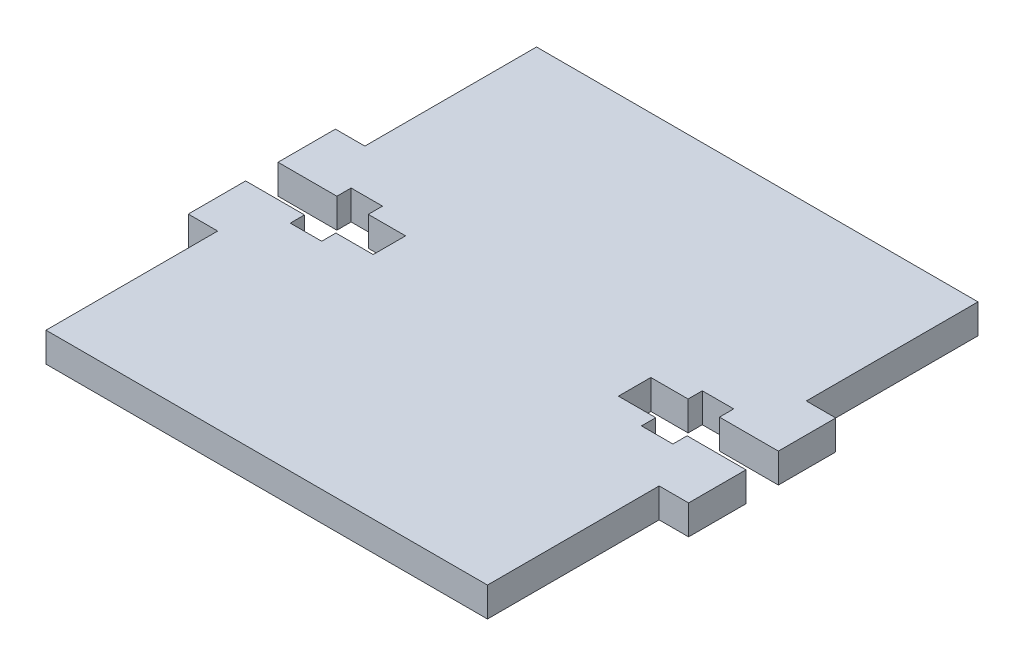
ISO-10303-21;
HEADER;
FILE_DESCRIPTION(('STEP AP214'),'2;1');
FILE_NAME('part.step','',(''),(''),'','','');
FILE_SCHEMA(('AUTOMOTIVE_DESIGN { 1 0 10303 214 1 1 1 1 }'));
ENDSEC;
DATA;
#1=APPLICATION_CONTEXT('core data for automotive mechanical design processes');
#2=APPLICATION_PROTOCOL_DEFINITION('international standard','automotive_design',2000,#1);
#3=PRODUCT_CONTEXT('',#1,'mechanical');
#4=PRODUCT('Part','Part','',(#3));
#5=PRODUCT_RELATED_PRODUCT_CATEGORY('part','',(#4));
#6=PRODUCT_DEFINITION_FORMATION('','',#4);
#7=PRODUCT_DEFINITION_CONTEXT('part definition',#1,'design');
#8=PRODUCT_DEFINITION('design','',#6,#7);
#9=PRODUCT_DEFINITION_SHAPE('','',#8);
#10=(LENGTH_UNIT() NAMED_UNIT(*) SI_UNIT(.MILLI.,.METRE.));
#11=(NAMED_UNIT(*) PLANE_ANGLE_UNIT() SI_UNIT($,.RADIAN.));
#12=(NAMED_UNIT(*) SI_UNIT($,.STERADIAN.) SOLID_ANGLE_UNIT());
#13=UNCERTAINTY_MEASURE_WITH_UNIT(LENGTH_MEASURE(1.E-05),#10,'distance_accuracy_value','');
#14=(GEOMETRIC_REPRESENTATION_CONTEXT(3) GLOBAL_UNCERTAINTY_ASSIGNED_CONTEXT((#13)) GLOBAL_UNIT_ASSIGNED_CONTEXT((#10,
#11,#12)) REPRESENTATION_CONTEXT('',''));
#15=CARTESIAN_POINT('',(0.,0.,0.));
#16=DIRECTION('',(0.,0.,1.));
#17=DIRECTION('',(1.,0.,0.));
#18=AXIS2_PLACEMENT_3D('',#15,#16,#17);
#19=CARTESIAN_POINT('',(0.,1.5,0.));
#20=DIRECTION('',(0.,1.,0.));
#21=DIRECTION('',(0.,0.,1.));
#22=AXIS2_PLACEMENT_3D('',#19,#20,#21);
#23=PLANE('',#22);
#24=DIRECTION('',(0.,0.,1.));
#25=VECTOR('',#24,1.);
#26=CARTESIAN_POINT('',(-19.5,1.5,0.));
#27=LINE('',#26,#25);
#28=CARTESIAN_POINT('',(-19.5,1.5,1.65));
#29=VERTEX_POINT('',#28);
#30=CARTESIAN_POINT('',(-19.5,1.5,3.1));
#31=VERTEX_POINT('',#30);
#32=EDGE_CURVE('E366',#29,#31,#27,.T.);
#33=ORIENTED_EDGE('',*,*,#32,.F.);
#34=DIRECTION('',(-1.,0.,0.));
#35=VECTOR('',#34,1.);
#36=CARTESIAN_POINT('',(0.,1.5,1.65));
#37=LINE('',#36,#35);
#38=CARTESIAN_POINT('',(-25.5,1.5,1.65));
#39=VERTEX_POINT('',#38);
#40=EDGE_CURVE('E352',#29,#39,#37,.T.);
#41=ORIENTED_EDGE('',*,*,#40,.T.);
#42=DIRECTION('',(0.,0.,1.));
#43=VECTOR('',#42,1.);
#44=CARTESIAN_POINT('',(-25.5,1.5,0.));
#45=LINE('',#44,#43);
#46=CARTESIAN_POINT('',(-25.5,1.5,7.5));
#47=VERTEX_POINT('',#46);
#48=EDGE_CURVE('E476',#39,#47,#45,.T.);
#49=ORIENTED_EDGE('',*,*,#48,.T.);
#50=DIRECTION('',(-1.,0.,0.));
#51=VECTOR('',#50,1.);
#52=CARTESIAN_POINT('',(0.,1.5,7.5));
#53=LINE('',#52,#51);
#54=CARTESIAN_POINT('',(-22.5,1.5,7.5));
#55=VERTEX_POINT('',#54);
#56=EDGE_CURVE('E480',#55,#47,#53,.T.);
#57=ORIENTED_EDGE('',*,*,#56,.F.);
#58=DIRECTION('',(0.,0.,1.));
#59=VECTOR('',#58,1.);
#60=CARTESIAN_POINT('',(-22.5,1.5,0.));
#61=LINE('',#60,#59);
#62=CARTESIAN_POINT('',(-22.5,1.5,25.));
#63=VERTEX_POINT('',#62);
#64=EDGE_CURVE('E474',#55,#63,#61,.T.);
#65=ORIENTED_EDGE('',*,*,#64,.T.);
#66=DIRECTION('',(1.,0.,0.));
#67=VECTOR('',#66,1.);
#68=CARTESIAN_POINT('',(0.,1.5,25.));
#69=LINE('',#68,#67);
#70=CARTESIAN_POINT('',(22.5,1.5,25.));
#71=VERTEX_POINT('',#70);
#72=EDGE_CURVE('E483',#63,#71,#69,.T.);
#73=ORIENTED_EDGE('',*,*,#72,.T.);
#74=DIRECTION('',(0.,0.,1.));
#75=VECTOR('',#74,1.);
#76=CARTESIAN_POINT('',(22.5,1.5,0.));
#77=LINE('',#76,#75);
#78=CARTESIAN_POINT('',(22.5,1.5,7.5));
#79=VERTEX_POINT('',#78);
#80=EDGE_CURVE('E468',#79,#71,#77,.T.);
#81=ORIENTED_EDGE('',*,*,#80,.F.);
#82=DIRECTION('',(1.,0.,0.));
#83=VECTOR('',#82,1.);
#84=CARTESIAN_POINT('',(0.,1.5,7.5));
#85=LINE('',#84,#83);
#86=CARTESIAN_POINT('',(25.5,1.5,7.5));
#87=VERTEX_POINT('',#86);
#88=EDGE_CURVE('E485',#79,#87,#85,.T.);
#89=ORIENTED_EDGE('',*,*,#88,.T.);
#90=DIRECTION('',(0.,0.,1.));
#91=VECTOR('',#90,1.);
#92=CARTESIAN_POINT('',(25.5,1.5,0.));
#93=LINE('',#92,#91);
#94=CARTESIAN_POINT('',(25.5,1.5,1.65));
#95=VERTEX_POINT('',#94);
#96=EDGE_CURVE('E488',#95,#87,#93,.T.);
#97=ORIENTED_EDGE('',*,*,#96,.F.);
#98=DIRECTION('',(1.,0.,0.));
#99=VECTOR('',#98,1.);
#100=CARTESIAN_POINT('',(0.,1.5,1.65));
#101=LINE('',#100,#99);
#102=CARTESIAN_POINT('',(19.5,1.5,1.65));
#103=VERTEX_POINT('',#102);
#104=EDGE_CURVE('E442',#103,#95,#101,.T.);
#105=ORIENTED_EDGE('',*,*,#104,.F.);
#106=DIRECTION('',(0.,0.,1.));
#107=VECTOR('',#106,1.);
#108=CARTESIAN_POINT('',(19.5,1.5,0.));
#109=LINE('',#108,#107);
#110=CARTESIAN_POINT('',(19.5,1.5,3.1));
#111=VERTEX_POINT('',#110);
#112=EDGE_CURVE('E439',#103,#111,#109,.T.);
#113=ORIENTED_EDGE('',*,*,#112,.T.);
#114=DIRECTION('',(1.,0.,0.));
#115=VECTOR('',#114,1.);
#116=CARTESIAN_POINT('',(0.,1.5,3.1));
#117=LINE('',#116,#115);
#118=CARTESIAN_POINT('',(16.3,1.5,3.1));
#119=VERTEX_POINT('',#118);
#120=EDGE_CURVE('E437',#119,#111,#117,.T.);
#121=ORIENTED_EDGE('',*,*,#120,.F.);
#122=DIRECTION('',(0.,0.,1.));
#123=VECTOR('',#122,1.);
#124=CARTESIAN_POINT('',(16.3,1.5,0.));
#125=LINE('',#124,#123);
#126=CARTESIAN_POINT('',(16.3,1.5,1.65));
#127=VERTEX_POINT('',#126);
#128=EDGE_CURVE('E405',#127,#119,#125,.T.);
#129=ORIENTED_EDGE('',*,*,#128,.F.);
#130=DIRECTION('',(1.,0.,0.));
#131=VECTOR('',#130,1.);
#132=CARTESIAN_POINT('',(0.,1.5,1.65));
#133=LINE('',#132,#131);
#134=CARTESIAN_POINT('',(12.5,1.5,1.65));
#135=VERTEX_POINT('',#134);
#136=EDGE_CURVE('E460',#135,#127,#133,.T.);
#137=ORIENTED_EDGE('',*,*,#136,.F.);
#138=DIRECTION('',(0.,0.,1.));
#139=VECTOR('',#138,1.);
#140=CARTESIAN_POINT('',(12.5,1.5,0.));
#141=LINE('',#140,#139);
#142=CARTESIAN_POINT('',(12.5,1.5,-1.65));
#143=VERTEX_POINT('',#142);
#144=EDGE_CURVE('E458',#143,#135,#141,.T.);
#145=ORIENTED_EDGE('',*,*,#144,.F.);
#146=DIRECTION('',(1.,0.,0.));
#147=VECTOR('',#146,1.);
#148=CARTESIAN_POINT('',(0.,1.5,-1.65));
#149=LINE('',#148,#147);
#150=CARTESIAN_POINT('',(16.3,1.5,-1.65));
#151=VERTEX_POINT('',#150);
#152=EDGE_CURVE('E455',#143,#151,#149,.T.);
#153=ORIENTED_EDGE('',*,*,#152,.T.);
#154=DIRECTION('',(0.,0.,1.));
#155=VECTOR('',#154,1.);
#156=CARTESIAN_POINT('',(16.3,1.5,0.));
#157=LINE('',#156,#155);
#158=CARTESIAN_POINT('',(16.3,1.5,-3.1));
#159=VERTEX_POINT('',#158);
#160=EDGE_CURVE('E453',#159,#151,#157,.T.);
#161=ORIENTED_EDGE('',*,*,#160,.F.);
#162=DIRECTION('',(1.,0.,0.));
#163=VECTOR('',#162,1.);
#164=CARTESIAN_POINT('',(0.,1.5,-3.1));
#165=LINE('',#164,#163);
#166=CARTESIAN_POINT('',(19.5,1.5,-3.1));
#167=VERTEX_POINT('',#166);
#168=EDGE_CURVE('E450',#159,#167,#165,.T.);
#169=ORIENTED_EDGE('',*,*,#168,.T.);
#170=DIRECTION('',(0.,0.,1.));
#171=VECTOR('',#170,1.);
#172=CARTESIAN_POINT('',(19.5,1.5,0.));
#173=LINE('',#172,#171);
#174=CARTESIAN_POINT('',(19.5,1.5,-1.65));
#175=VERTEX_POINT('',#174);
#176=EDGE_CURVE('E447',#167,#175,#173,.T.);
#177=ORIENTED_EDGE('',*,*,#176,.T.);
#178=DIRECTION('',(1.,0.,0.));
#179=VECTOR('',#178,1.);
#180=CARTESIAN_POINT('',(0.,1.5,-1.65));
#181=LINE('',#180,#179);
#182=CARTESIAN_POINT('',(25.5,1.5,-1.65));
#183=VERTEX_POINT('',#182);
#184=EDGE_CURVE('E444',#175,#183,#181,.T.);
#185=ORIENTED_EDGE('',*,*,#184,.T.);
#186=CARTESIAN_POINT('',(25.5,1.5,-7.5));
#187=VERTEX_POINT('',#186);
#188=EDGE_CURVE('E489',#187,#183,#93,.T.);
#189=ORIENTED_EDGE('',*,*,#188,.F.);
#190=DIRECTION('',(1.,0.,0.));
#191=VECTOR('',#190,1.);
#192=CARTESIAN_POINT('',(0.,1.5,-7.49999999999999));
#193=LINE('',#192,#191);
#194=CARTESIAN_POINT('',(22.5,1.5,-7.5));
#195=VERTEX_POINT('',#194);
#196=EDGE_CURVE('E492',#195,#187,#193,.T.);
#197=ORIENTED_EDGE('',*,*,#196,.F.);
#198=CARTESIAN_POINT('',(22.5,1.5,-25.));
#199=VERTEX_POINT('',#198);
#200=EDGE_CURVE('E463',#199,#195,#77,.T.);
#201=ORIENTED_EDGE('',*,*,#200,.F.);
#202=DIRECTION('',(1.,0.,0.));
#203=VECTOR('',#202,1.);
#204=CARTESIAN_POINT('',(0.,1.5,-25.));
#205=LINE('',#204,#203);
#206=CARTESIAN_POINT('',(-22.5,1.5,-25.));
#207=VERTEX_POINT('',#206);
#208=EDGE_CURVE('E466',#207,#199,#205,.T.);
#209=ORIENTED_EDGE('',*,*,#208,.F.);
#210=CARTESIAN_POINT('',(-22.5,1.5,-7.5));
#211=VERTEX_POINT('',#210);
#212=EDGE_CURVE('E471',#207,#211,#61,.T.);
#213=ORIENTED_EDGE('',*,*,#212,.T.);
#214=DIRECTION('',(-1.,0.,0.));
#215=VECTOR('',#214,1.);
#216=CARTESIAN_POINT('',(0.,1.5,-7.49999999999999));
#217=LINE('',#216,#215);
#218=CARTESIAN_POINT('',(-25.5,1.5,-7.5));
#219=VERTEX_POINT('',#218);
#220=EDGE_CURVE('E473',#211,#219,#217,.T.);
#221=ORIENTED_EDGE('',*,*,#220,.T.);
#222=CARTESIAN_POINT('',(-25.5,1.5,-1.65));
#223=VERTEX_POINT('',#222);
#224=EDGE_CURVE('E477',#219,#223,#45,.T.);
#225=ORIENTED_EDGE('',*,*,#224,.T.);
#226=DIRECTION('',(-1.,0.,0.));
#227=VECTOR('',#226,1.);
#228=CARTESIAN_POINT('',(0.,1.5,-1.65));
#229=LINE('',#228,#227);
#230=CARTESIAN_POINT('',(-19.5,1.5,-1.65));
#231=VERTEX_POINT('',#230);
#232=EDGE_CURVE('E56',#231,#223,#229,.T.);
#233=ORIENTED_EDGE('',*,*,#232,.F.);
#234=DIRECTION('',(0.,0.,1.));
#235=VECTOR('',#234,1.);
#236=CARTESIAN_POINT('',(-19.5,1.5,0.));
#237=LINE('',#236,#235);
#238=CARTESIAN_POINT('',(-19.5,1.5,-3.1));
#239=VERTEX_POINT('',#238);
#240=EDGE_CURVE('E364',#239,#231,#237,.T.);
#241=ORIENTED_EDGE('',*,*,#240,.F.);
#242=DIRECTION('',(-1.,0.,0.));
#243=VECTOR('',#242,1.);
#244=CARTESIAN_POINT('',(0.,1.5,-3.1));
#245=LINE('',#244,#243);
#246=CARTESIAN_POINT('',(-16.3,1.5,-3.1));
#247=VERTEX_POINT('',#246);
#248=EDGE_CURVE('E362',#247,#239,#245,.T.);
#249=ORIENTED_EDGE('',*,*,#248,.F.);
#250=DIRECTION('',(0.,0.,1.));
#251=VECTOR('',#250,1.);
#252=CARTESIAN_POINT('',(-16.3,1.5,0.));
#253=LINE('',#252,#251);
#254=CARTESIAN_POINT('',(-16.3,1.5,-1.65));
#255=VERTEX_POINT('',#254);
#256=EDGE_CURVE('E359',#247,#255,#253,.T.);
#257=ORIENTED_EDGE('',*,*,#256,.T.);
#258=DIRECTION('',(-1.,0.,0.));
#259=VECTOR('',#258,1.);
#260=CARTESIAN_POINT('',(0.,1.5,-1.65));
#261=LINE('',#260,#259);
#262=CARTESIAN_POINT('',(-12.5,1.5,-1.65));
#263=VERTEX_POINT('',#262);
#264=EDGE_CURVE('E357',#263,#255,#261,.T.);
#265=ORIENTED_EDGE('',*,*,#264,.F.);
#266=DIRECTION('',(0.,0.,1.));
#267=VECTOR('',#266,1.);
#268=CARTESIAN_POINT('',(-12.5,1.5,0.));
#269=LINE('',#268,#267);
#270=CARTESIAN_POINT('',(-12.5,1.5,1.65));
#271=VERTEX_POINT('',#270);
#272=EDGE_CURVE('E355',#263,#271,#269,.T.);
#273=ORIENTED_EDGE('',*,*,#272,.T.);
#274=DIRECTION('',(-1.,0.,0.));
#275=VECTOR('',#274,1.);
#276=CARTESIAN_POINT('',(0.,1.5,1.65));
#277=LINE('',#276,#275);
#278=CARTESIAN_POINT('',(-16.3,1.5,1.65));
#279=VERTEX_POINT('',#278);
#280=EDGE_CURVE('E295',#271,#279,#277,.T.);
#281=ORIENTED_EDGE('',*,*,#280,.T.);
#282=DIRECTION('',(0.,0.,1.));
#283=VECTOR('',#282,1.);
#284=CARTESIAN_POINT('',(-16.3,1.5,0.));
#285=LINE('',#284,#283);
#286=CARTESIAN_POINT('',(-16.3,1.5,3.1));
#287=VERTEX_POINT('',#286);
#288=EDGE_CURVE('E371',#279,#287,#285,.T.);
#289=ORIENTED_EDGE('',*,*,#288,.T.);
#290=DIRECTION('',(-1.,0.,0.));
#291=VECTOR('',#290,1.);
#292=CARTESIAN_POINT('',(0.,1.5,3.1));
#293=LINE('',#292,#291);
#294=EDGE_CURVE('E368',#287,#31,#293,.T.);
#295=ORIENTED_EDGE('',*,*,#294,.T.);
#296=EDGE_LOOP('',(#33,#41,#49,#57,#65,#73,#81,#89,#97,#105,#113,#121,#129,#137,#145,#153,#161,
#169,#177,#185,#189,#197,#201,#209,#213,#221,#225,#233,#241,#249,#257,#265,#273,#281,#289,#295));
#297=FACE_BOUND('',#296,.T.);
#298=ADVANCED_FACE('F41',(#297),#23,.T.);
#299=CARTESIAN_POINT('',(0.,-1.5,0.));
#300=DIRECTION('',(0.,1.,0.));
#301=DIRECTION('',(0.,0.,1.));
#302=AXIS2_PLACEMENT_3D('',#299,#300,#301);
#303=PLANE('',#302);
#304=DIRECTION('',(-1.,0.,0.));
#305=VECTOR('',#304,1.);
#306=CARTESIAN_POINT('',(0.,-1.5,1.65));
#307=LINE('',#306,#305);
#308=CARTESIAN_POINT('',(-19.5,-1.5,1.65));
#309=VERTEX_POINT('',#308);
#310=CARTESIAN_POINT('',(-25.5,-1.5,1.65));
#311=VERTEX_POINT('',#310);
#312=EDGE_CURVE('E316',#309,#311,#307,.T.);
#313=ORIENTED_EDGE('',*,*,#312,.F.);
#314=DIRECTION('',(0.,0.,1.));
#315=VECTOR('',#314,1.);
#316=CARTESIAN_POINT('',(-19.5,-1.5,0.));
#317=LINE('',#316,#315);
#318=CARTESIAN_POINT('',(-19.5,-1.5,3.1));
#319=VERTEX_POINT('',#318);
#320=EDGE_CURVE('E318',#309,#319,#317,.T.);
#321=ORIENTED_EDGE('',*,*,#320,.T.);
#322=DIRECTION('',(-1.,0.,0.));
#323=VECTOR('',#322,1.);
#324=CARTESIAN_POINT('',(0.,-1.5,3.1));
#325=LINE('',#324,#323);
#326=CARTESIAN_POINT('',(-16.3,-1.5,3.1));
#327=VERTEX_POINT('',#326);
#328=EDGE_CURVE('E321',#327,#319,#325,.T.);
#329=ORIENTED_EDGE('',*,*,#328,.F.);
#330=DIRECTION('',(0.,0.,1.));
#331=VECTOR('',#330,1.);
#332=CARTESIAN_POINT('',(-16.3,-1.5,0.));
#333=LINE('',#332,#331);
#334=CARTESIAN_POINT('',(-16.3,-1.5,1.65));
#335=VERTEX_POINT('',#334);
#336=EDGE_CURVE('E296',#335,#327,#333,.T.);
#337=ORIENTED_EDGE('',*,*,#336,.F.);
#338=DIRECTION('',(-1.,0.,0.));
#339=VECTOR('',#338,1.);
#340=CARTESIAN_POINT('',(0.,-1.5,1.65));
#341=LINE('',#340,#339);
#342=CARTESIAN_POINT('',(-12.5,-1.5,1.65));
#343=VERTEX_POINT('',#342);
#344=EDGE_CURVE('E288',#343,#335,#341,.T.);
#345=ORIENTED_EDGE('',*,*,#344,.F.);
#346=DIRECTION('',(0.,0.,1.));
#347=VECTOR('',#346,1.);
#348=CARTESIAN_POINT('',(-12.5,-1.5,0.));
#349=LINE('',#348,#347);
#350=CARTESIAN_POINT('',(-12.5,-1.5,-1.65));
#351=VERTEX_POINT('',#350);
#352=EDGE_CURVE('E276',#351,#343,#349,.T.);
#353=ORIENTED_EDGE('',*,*,#352,.F.);
#354=DIRECTION('',(-1.,0.,0.));
#355=VECTOR('',#354,1.);
#356=CARTESIAN_POINT('',(0.,-1.5,-1.65));
#357=LINE('',#356,#355);
#358=CARTESIAN_POINT('',(-16.3,-1.5,-1.65));
#359=VERTEX_POINT('',#358);
#360=EDGE_CURVE('E287',#351,#359,#357,.T.);
#361=ORIENTED_EDGE('',*,*,#360,.T.);
#362=DIRECTION('',(0.,0.,1.));
#363=VECTOR('',#362,1.);
#364=CARTESIAN_POINT('',(-16.3,-1.5,0.));
#365=LINE('',#364,#363);
#366=CARTESIAN_POINT('',(-16.3,-1.5,-3.1));
#367=VERTEX_POINT('',#366);
#368=EDGE_CURVE('E305',#367,#359,#365,.T.);
#369=ORIENTED_EDGE('',*,*,#368,.F.);
#370=DIRECTION('',(-1.,0.,0.));
#371=VECTOR('',#370,1.);
#372=CARTESIAN_POINT('',(0.,-1.5,-3.1));
#373=LINE('',#372,#371);
#374=CARTESIAN_POINT('',(-19.5,-1.5,-3.1));
#375=VERTEX_POINT('',#374);
#376=EDGE_CURVE('E307',#367,#375,#373,.T.);
#377=ORIENTED_EDGE('',*,*,#376,.T.);
#378=DIRECTION('',(0.,0.,1.));
#379=VECTOR('',#378,1.);
#380=CARTESIAN_POINT('',(-19.5,-1.5,0.));
#381=LINE('',#380,#379);
#382=CARTESIAN_POINT('',(-19.5,-1.5,-1.65));
#383=VERTEX_POINT('',#382);
#384=EDGE_CURVE('E310',#375,#383,#381,.T.);
#385=ORIENTED_EDGE('',*,*,#384,.T.);
#386=DIRECTION('',(-1.,0.,0.));
#387=VECTOR('',#386,1.);
#388=CARTESIAN_POINT('',(0.,-1.5,-1.65));
#389=LINE('',#388,#387);
#390=CARTESIAN_POINT('',(-25.5,-1.5,-1.65));
#391=VERTEX_POINT('',#390);
#392=EDGE_CURVE('E313',#383,#391,#389,.T.);
#393=ORIENTED_EDGE('',*,*,#392,.T.);
#394=DIRECTION('',(0.,0.,1.));
#395=VECTOR('',#394,1.);
#396=CARTESIAN_POINT('',(-25.5,-1.5,0.));
#397=LINE('',#396,#395);
#398=CARTESIAN_POINT('',(-25.5,-1.5,-7.5));
#399=VERTEX_POINT('',#398);
#400=EDGE_CURVE('E508',#399,#391,#397,.T.);
#401=ORIENTED_EDGE('',*,*,#400,.F.);
#402=DIRECTION('',(-1.,0.,0.));
#403=VECTOR('',#402,1.);
#404=CARTESIAN_POINT('',(0.,-1.5,-7.49999999999999));
#405=LINE('',#404,#403);
#406=CARTESIAN_POINT('',(-22.5,-1.5,-7.5));
#407=VERTEX_POINT('',#406);
#408=EDGE_CURVE('E504',#407,#399,#405,.T.);
#409=ORIENTED_EDGE('',*,*,#408,.F.);
#410=DIRECTION('',(0.,0.,1.));
#411=VECTOR('',#410,1.);
#412=CARTESIAN_POINT('',(-22.5,-1.5,0.));
#413=LINE('',#412,#411);
#414=CARTESIAN_POINT('',(-22.5,-1.5,-25.));
#415=VERTEX_POINT('',#414);
#416=EDGE_CURVE('E502',#415,#407,#413,.T.);
#417=ORIENTED_EDGE('',*,*,#416,.F.);
#418=DIRECTION('',(1.,0.,0.));
#419=VECTOR('',#418,1.);
#420=CARTESIAN_POINT('',(0.,-1.5,-25.));
#421=LINE('',#420,#419);
#422=CARTESIAN_POINT('',(22.5,-1.5,-25.));
#423=VERTEX_POINT('',#422);
#424=EDGE_CURVE('E498',#415,#423,#421,.T.);
#425=ORIENTED_EDGE('',*,*,#424,.T.);
#426=DIRECTION('',(0.,0.,1.));
#427=VECTOR('',#426,1.);
#428=CARTESIAN_POINT('',(22.5,-1.5,0.));
#429=LINE('',#428,#427);
#430=CARTESIAN_POINT('',(22.5,-1.5,-7.5));
#431=VERTEX_POINT('',#430);
#432=EDGE_CURVE('E462',#423,#431,#429,.T.);
#433=ORIENTED_EDGE('',*,*,#432,.T.);
#434=DIRECTION('',(1.,0.,0.));
#435=VECTOR('',#434,1.);
#436=CARTESIAN_POINT('',(0.,-1.5,-7.49999999999999));
#437=LINE('',#436,#435);
#438=CARTESIAN_POINT('',(25.5,-1.5,-7.5));
#439=VERTEX_POINT('',#438);
#440=EDGE_CURVE('E467',#431,#439,#437,.T.);
#441=ORIENTED_EDGE('',*,*,#440,.T.);
#442=DIRECTION('',(0.,0.,1.));
#443=VECTOR('',#442,1.);
#444=CARTESIAN_POINT('',(25.5,-1.5,0.));
#445=LINE('',#444,#443);
#446=CARTESIAN_POINT('',(25.5,-1.5,-1.65));
#447=VERTEX_POINT('',#446);
#448=EDGE_CURVE('E521',#439,#447,#445,.T.);
#449=ORIENTED_EDGE('',*,*,#448,.T.);
#450=DIRECTION('',(1.,0.,0.));
#451=VECTOR('',#450,1.);
#452=CARTESIAN_POINT('',(0.,-1.5,-1.65));
#453=LINE('',#452,#451);
#454=CARTESIAN_POINT('',(19.5,-1.5,-1.65));
#455=VERTEX_POINT('',#454);
#456=EDGE_CURVE('E387',#455,#447,#453,.T.);
#457=ORIENTED_EDGE('',*,*,#456,.F.);
#458=DIRECTION('',(0.,0.,1.));
#459=VECTOR('',#458,1.);
#460=CARTESIAN_POINT('',(19.5,-1.5,0.));
#461=LINE('',#460,#459);
#462=CARTESIAN_POINT('',(19.5,-1.5,-3.1));
#463=VERTEX_POINT('',#462);
#464=EDGE_CURVE('E389',#463,#455,#461,.T.);
#465=ORIENTED_EDGE('',*,*,#464,.F.);
#466=DIRECTION('',(1.,0.,0.));
#467=VECTOR('',#466,1.);
#468=CARTESIAN_POINT('',(0.,-1.5,-3.1));
#469=LINE('',#468,#467);
#470=CARTESIAN_POINT('',(16.3,-1.5,-3.1));
#471=VERTEX_POINT('',#470);
#472=EDGE_CURVE('E391',#471,#463,#469,.T.);
#473=ORIENTED_EDGE('',*,*,#472,.F.);
#474=DIRECTION('',(0.,0.,1.));
#475=VECTOR('',#474,1.);
#476=CARTESIAN_POINT('',(16.3,-1.5,0.));
#477=LINE('',#476,#475);
#478=CARTESIAN_POINT('',(16.3,-1.5,-1.65));
#479=VERTEX_POINT('',#478);
#480=EDGE_CURVE('E393',#471,#479,#477,.T.);
#481=ORIENTED_EDGE('',*,*,#480,.T.);
#482=DIRECTION('',(1.,0.,0.));
#483=VECTOR('',#482,1.);
#484=CARTESIAN_POINT('',(0.,-1.5,-1.65));
#485=LINE('',#484,#483);
#486=CARTESIAN_POINT('',(12.5,-1.5,-1.65));
#487=VERTEX_POINT('',#486);
#488=EDGE_CURVE('E396',#487,#479,#485,.T.);
#489=ORIENTED_EDGE('',*,*,#488,.F.);
#490=DIRECTION('',(0.,0.,1.));
#491=VECTOR('',#490,1.);
#492=CARTESIAN_POINT('',(12.5,-1.5,0.));
#493=LINE('',#492,#491);
#494=CARTESIAN_POINT('',(12.5,-1.5,1.65));
#495=VERTEX_POINT('',#494);
#496=EDGE_CURVE('E398',#487,#495,#493,.T.);
#497=ORIENTED_EDGE('',*,*,#496,.T.);
#498=DIRECTION('',(1.,0.,0.));
#499=VECTOR('',#498,1.);
#500=CARTESIAN_POINT('',(0.,-1.5,1.65));
#501=LINE('',#500,#499);
#502=CARTESIAN_POINT('',(16.3,-1.5,1.65));
#503=VERTEX_POINT('',#502);
#504=EDGE_CURVE('E375',#495,#503,#501,.T.);
#505=ORIENTED_EDGE('',*,*,#504,.T.);
#506=DIRECTION('',(0.,0.,1.));
#507=VECTOR('',#506,1.);
#508=CARTESIAN_POINT('',(16.3,-1.5,0.));
#509=LINE('',#508,#507);
#510=CARTESIAN_POINT('',(16.3,-1.5,3.1));
#511=VERTEX_POINT('',#510);
#512=EDGE_CURVE('E378',#503,#511,#509,.T.);
#513=ORIENTED_EDGE('',*,*,#512,.T.);
#514=DIRECTION('',(1.,0.,0.));
#515=VECTOR('',#514,1.);
#516=CARTESIAN_POINT('',(0.,-1.5,3.1));
#517=LINE('',#516,#515);
#518=CARTESIAN_POINT('',(19.5,-1.5,3.1));
#519=VERTEX_POINT('',#518);
#520=EDGE_CURVE('E64',#511,#519,#517,.T.);
#521=ORIENTED_EDGE('',*,*,#520,.T.);
#522=DIRECTION('',(0.,0.,1.));
#523=VECTOR('',#522,1.);
#524=CARTESIAN_POINT('',(19.5,-1.5,0.));
#525=LINE('',#524,#523);
#526=CARTESIAN_POINT('',(19.5,-1.5,1.65));
#527=VERTEX_POINT('',#526);
#528=EDGE_CURVE('E382',#527,#519,#525,.T.);
#529=ORIENTED_EDGE('',*,*,#528,.F.);
#530=DIRECTION('',(1.,0.,0.));
#531=VECTOR('',#530,1.);
#532=CARTESIAN_POINT('',(0.,-1.5,1.65));
#533=LINE('',#532,#531);
#534=CARTESIAN_POINT('',(25.5,-1.5,1.65));
#535=VERTEX_POINT('',#534);
#536=EDGE_CURVE('E384',#527,#535,#533,.T.);
#537=ORIENTED_EDGE('',*,*,#536,.T.);
#538=CARTESIAN_POINT('',(25.5,-1.5,7.5));
#539=VERTEX_POINT('',#538);
#540=EDGE_CURVE('E520',#535,#539,#445,.T.);
#541=ORIENTED_EDGE('',*,*,#540,.T.);
#542=DIRECTION('',(1.,0.,0.));
#543=VECTOR('',#542,1.);
#544=CARTESIAN_POINT('',(0.,-1.5,7.5));
#545=LINE('',#544,#543);
#546=CARTESIAN_POINT('',(22.5,-1.5,7.5));
#547=VERTEX_POINT('',#546);
#548=EDGE_CURVE('E517',#547,#539,#545,.T.);
#549=ORIENTED_EDGE('',*,*,#548,.F.);
#550=CARTESIAN_POINT('',(22.5,-1.5,25.));
#551=VERTEX_POINT('',#550);
#552=EDGE_CURVE('E499',#547,#551,#429,.T.);
#553=ORIENTED_EDGE('',*,*,#552,.T.);
#554=DIRECTION('',(1.,0.,0.));
#555=VECTOR('',#554,1.);
#556=CARTESIAN_POINT('',(0.,-1.5,25.));
#557=LINE('',#556,#555);
#558=CARTESIAN_POINT('',(-22.5,-1.5,25.));
#559=VERTEX_POINT('',#558);
#560=EDGE_CURVE('E514',#559,#551,#557,.T.);
#561=ORIENTED_EDGE('',*,*,#560,.F.);
#562=CARTESIAN_POINT('',(-22.5,-1.5,7.5));
#563=VERTEX_POINT('',#562);
#564=EDGE_CURVE('E505',#563,#559,#413,.T.);
#565=ORIENTED_EDGE('',*,*,#564,.F.);
#566=DIRECTION('',(-1.,0.,0.));
#567=VECTOR('',#566,1.);
#568=CARTESIAN_POINT('',(0.,-1.5,7.5));
#569=LINE('',#568,#567);
#570=CARTESIAN_POINT('',(-25.5,-1.5,7.5));
#571=VERTEX_POINT('',#570);
#572=EDGE_CURVE('E511',#563,#571,#569,.T.);
#573=ORIENTED_EDGE('',*,*,#572,.T.);
#574=EDGE_CURVE('E507',#311,#571,#397,.T.);
#575=ORIENTED_EDGE('',*,*,#574,.F.);
#576=EDGE_LOOP('',(#313,#321,#329,#337,#345,#353,#361,#369,#377,#385,#393,#401,#409,#417,#425,
#433,#441,#449,#457,#465,#473,#481,#489,#497,#505,#513,#521,#529,#537,#541,#549,#553,#561,#565,
#573,#575));
#577=FACE_BOUND('',#576,.T.);
#578=ADVANCED_FACE('F300',(#577),#303,.F.);
#579=CARTESIAN_POINT('',(-25.5,1.5,0.));
#580=DIRECTION('',(1.,0.,0.));
#581=DIRECTION('',(0.,0.,-1.));
#582=AXIS2_PLACEMENT_3D('',#579,#580,#581);
#583=PLANE('',#582);
#584=DIRECTION('',(0.,1.,0.));
#585=VECTOR('',#584,1.);
#586=CARTESIAN_POINT('',(-25.5,-1.5,1.65));
#587=LINE('',#586,#585);
#588=EDGE_CURVE('E335',#311,#39,#587,.T.);
#589=ORIENTED_EDGE('',*,*,#588,.F.);
#590=ORIENTED_EDGE('',*,*,#574,.T.);
#591=DIRECTION('',(0.,-1.,0.));
#592=VECTOR('',#591,1.);
#593=CARTESIAN_POINT('',(-25.5,1.5,7.5));
#594=LINE('',#593,#592);
#595=EDGE_CURVE('E541',#47,#571,#594,.T.);
#596=ORIENTED_EDGE('',*,*,#595,.F.);
#597=ORIENTED_EDGE('',*,*,#48,.F.);
#598=EDGE_LOOP('',(#589,#590,#596,#597));
#599=FACE_BOUND('',#598,.T.);
#600=ADVANCED_FACE('F647',(#599),#583,.F.);
#601=CARTESIAN_POINT('',(25.5,1.5,0.));
#602=DIRECTION('',(1.,0.,0.));
#603=DIRECTION('',(0.,0.,-1.));
#604=AXIS2_PLACEMENT_3D('',#601,#602,#603);
#605=PLANE('',#604);
#606=ORIENTED_EDGE('',*,*,#188,.T.);
#607=DIRECTION('',(0.,1.,0.));
#608=VECTOR('',#607,1.);
#609=CARTESIAN_POINT('',(25.5,-1.5,-1.65));
#610=LINE('',#609,#608);
#611=EDGE_CURVE('E421',#447,#183,#610,.T.);
#612=ORIENTED_EDGE('',*,*,#611,.F.);
#613=ORIENTED_EDGE('',*,*,#448,.F.);
#614=DIRECTION('',(0.,-1.,0.));
#615=VECTOR('',#614,1.);
#616=CARTESIAN_POINT('',(25.5,1.5,-7.5));
#617=LINE('',#616,#615);
#618=EDGE_CURVE('E527',#187,#439,#617,.T.);
#619=ORIENTED_EDGE('',*,*,#618,.F.);
#620=EDGE_LOOP('',(#606,#612,#613,#619));
#621=FACE_BOUND('',#620,.T.);
#622=ADVANCED_FACE('F571',(#621),#605,.T.);
#623=CARTESIAN_POINT('',(22.5,1.5,0.));
#624=DIRECTION('',(1.,0.,0.));
#625=DIRECTION('',(0.,0.,-1.));
#626=AXIS2_PLACEMENT_3D('',#623,#624,#625);
#627=PLANE('',#626);
#628=ORIENTED_EDGE('',*,*,#432,.F.);
#629=DIRECTION('',(0.,-1.,0.));
#630=VECTOR('',#629,1.);
#631=CARTESIAN_POINT('',(22.5,1.5,-25.));
#632=LINE('',#631,#630);
#633=EDGE_CURVE('E11',#199,#423,#632,.T.);
#634=ORIENTED_EDGE('',*,*,#633,.F.);
#635=ORIENTED_EDGE('',*,*,#200,.T.);
#636=DIRECTION('',(0.,-1.,0.));
#637=VECTOR('',#636,1.);
#638=CARTESIAN_POINT('',(22.5,1.5,-7.5));
#639=LINE('',#638,#637);
#640=EDGE_CURVE('E495',#195,#431,#639,.T.);
#641=ORIENTED_EDGE('',*,*,#640,.T.);
#642=EDGE_LOOP('',(#628,#634,#635,#641));
#643=FACE_BOUND('',#642,.T.);
#644=ADVANCED_FACE('F562',(#643),#627,.T.);
#645=CARTESIAN_POINT('',(0.,1.5,-25.));
#646=DIRECTION('',(0.,0.,-1.));
#647=DIRECTION('',(-1.,0.,0.));
#648=AXIS2_PLACEMENT_3D('',#645,#646,#647);
#649=PLANE('',#648);
#650=ORIENTED_EDGE('',*,*,#424,.F.);
#651=DIRECTION('',(0.,-1.,0.));
#652=VECTOR('',#651,1.);
#653=CARTESIAN_POINT('',(-22.5,1.5,-25.));
#654=LINE('',#653,#652);
#655=EDGE_CURVE('E49',#207,#415,#654,.T.);
#656=ORIENTED_EDGE('',*,*,#655,.F.);
#657=ORIENTED_EDGE('',*,*,#208,.T.);
#658=ORIENTED_EDGE('',*,*,#633,.T.);
#659=EDGE_LOOP('',(#650,#656,#657,#658));
#660=FACE_BOUND('',#659,.T.);
#661=ADVANCED_FACE('F43',(#660),#649,.T.);
#662=CARTESIAN_POINT('',(-22.5,1.5,0.));
#663=DIRECTION('',(1.,0.,0.));
#664=DIRECTION('',(0.,0.,-1.));
#665=AXIS2_PLACEMENT_3D('',#662,#663,#664);
#666=PLANE('',#665);
#667=ORIENTED_EDGE('',*,*,#416,.T.);
#668=DIRECTION('',(0.,-1.,0.));
#669=VECTOR('',#668,1.);
#670=CARTESIAN_POINT('',(-22.5,1.5,-7.5));
#671=LINE('',#670,#669);
#672=EDGE_CURVE('E547',#211,#407,#671,.T.);
#673=ORIENTED_EDGE('',*,*,#672,.F.);
#674=ORIENTED_EDGE('',*,*,#212,.F.);
#675=ORIENTED_EDGE('',*,*,#655,.T.);
#676=EDGE_LOOP('',(#667,#673,#674,#675));
#677=FACE_BOUND('',#676,.T.);
#678=ADVANCED_FACE('F552',(#677),#666,.F.);
#679=CARTESIAN_POINT('',(0.,1.5,-7.49999999999999));
#680=DIRECTION('',(0.,0.,1.));
#681=DIRECTION('',(1.,0.,0.));
#682=AXIS2_PLACEMENT_3D('',#679,#680,#681);
#683=PLANE('',#682);
#684=ORIENTED_EDGE('',*,*,#408,.T.);
#685=DIRECTION('',(0.,-1.,0.));
#686=VECTOR('',#685,1.);
#687=CARTESIAN_POINT('',(-25.5,1.5,-7.5));
#688=LINE('',#687,#686);
#689=EDGE_CURVE('E544',#219,#399,#688,.T.);
#690=ORIENTED_EDGE('',*,*,#689,.F.);
#691=ORIENTED_EDGE('',*,*,#220,.F.);
#692=ORIENTED_EDGE('',*,*,#672,.T.);
#693=EDGE_LOOP('',(#684,#690,#691,#692));
#694=FACE_BOUND('',#693,.T.);
#695=ADVANCED_FACE('F693',(#694),#683,.F.);
#696=ORIENTED_EDGE('',*,*,#400,.T.);
#697=DIRECTION('',(0.,1.,0.));
#698=VECTOR('',#697,1.);
#699=CARTESIAN_POINT('',(-25.5,-1.5,-1.65));
#700=LINE('',#699,#698);
#701=EDGE_CURVE('E337',#391,#223,#700,.T.);
#702=ORIENTED_EDGE('',*,*,#701,.T.);
#703=ORIENTED_EDGE('',*,*,#224,.F.);
#704=ORIENTED_EDGE('',*,*,#689,.T.);
#705=EDGE_LOOP('',(#696,#702,#703,#704));
#706=FACE_BOUND('',#705,.T.);
#707=ADVANCED_FACE('F691',(#706),#583,.F.);
#708=CARTESIAN_POINT('',(0.,1.5,7.5));
#709=DIRECTION('',(0.,0.,1.));
#710=DIRECTION('',(1.,0.,0.));
#711=AXIS2_PLACEMENT_3D('',#708,#709,#710);
#712=PLANE('',#711);
#713=ORIENTED_EDGE('',*,*,#572,.F.);
#714=DIRECTION('',(0.,-1.,0.));
#715=VECTOR('',#714,1.);
#716=CARTESIAN_POINT('',(-22.5,1.5,7.5));
#717=LINE('',#716,#715);
#718=EDGE_CURVE('E539',#55,#563,#717,.T.);
#719=ORIENTED_EDGE('',*,*,#718,.F.);
#720=ORIENTED_EDGE('',*,*,#56,.T.);
#721=ORIENTED_EDGE('',*,*,#595,.T.);
#722=EDGE_LOOP('',(#713,#719,#720,#721));
#723=FACE_BOUND('',#722,.T.);
#724=ADVANCED_FACE('F640',(#723),#712,.T.);
#725=ORIENTED_EDGE('',*,*,#564,.T.);
#726=DIRECTION('',(0.,-1.,0.));
#727=VECTOR('',#726,1.);
#728=CARTESIAN_POINT('',(-22.5,1.5,25.));
#729=LINE('',#728,#727);
#730=EDGE_CURVE('E536',#63,#559,#729,.T.);
#731=ORIENTED_EDGE('',*,*,#730,.F.);
#732=ORIENTED_EDGE('',*,*,#64,.F.);
#733=ORIENTED_EDGE('',*,*,#718,.T.);
#734=EDGE_LOOP('',(#725,#731,#732,#733));
#735=FACE_BOUND('',#734,.T.);
#736=ADVANCED_FACE('F686',(#735),#666,.F.);
#737=CARTESIAN_POINT('',(0.,1.5,25.));
#738=DIRECTION('',(0.,0.,-1.));
#739=DIRECTION('',(-1.,0.,0.));
#740=AXIS2_PLACEMENT_3D('',#737,#738,#739);
#741=PLANE('',#740);
#742=ORIENTED_EDGE('',*,*,#560,.T.);
#743=DIRECTION('',(0.,-1.,0.));
#744=VECTOR('',#743,1.);
#745=CARTESIAN_POINT('',(22.5,1.5,25.));
#746=LINE('',#745,#744);
#747=EDGE_CURVE('E534',#71,#551,#746,.T.);
#748=ORIENTED_EDGE('',*,*,#747,.F.);
#749=ORIENTED_EDGE('',*,*,#72,.F.);
#750=ORIENTED_EDGE('',*,*,#730,.T.);
#751=EDGE_LOOP('',(#742,#748,#749,#750));
#752=FACE_BOUND('',#751,.T.);
#753=ADVANCED_FACE('F633',(#752),#741,.F.);
#754=ORIENTED_EDGE('',*,*,#552,.F.);
#755=DIRECTION('',(0.,-1.,0.));
#756=VECTOR('',#755,1.);
#757=CARTESIAN_POINT('',(22.5,1.5,7.5));
#758=LINE('',#757,#756);
#759=EDGE_CURVE('E532',#79,#547,#758,.T.);
#760=ORIENTED_EDGE('',*,*,#759,.F.);
#761=ORIENTED_EDGE('',*,*,#80,.T.);
#762=ORIENTED_EDGE('',*,*,#747,.T.);
#763=EDGE_LOOP('',(#754,#760,#761,#762));
#764=FACE_BOUND('',#763,.T.);
#765=ADVANCED_FACE('F627',(#764),#627,.T.);
#766=CARTESIAN_POINT('',(0.,1.5,7.5));
#767=DIRECTION('',(0.,0.,-1.));
#768=DIRECTION('',(-1.,0.,0.));
#769=AXIS2_PLACEMENT_3D('',#766,#767,#768);
#770=PLANE('',#769);
#771=ORIENTED_EDGE('',*,*,#548,.T.);
#772=DIRECTION('',(0.,-1.,0.));
#773=VECTOR('',#772,1.);
#774=CARTESIAN_POINT('',(25.5,1.5,7.5));
#775=LINE('',#774,#773);
#776=EDGE_CURVE('E529',#87,#539,#775,.T.);
#777=ORIENTED_EDGE('',*,*,#776,.F.);
#778=ORIENTED_EDGE('',*,*,#88,.F.);
#779=ORIENTED_EDGE('',*,*,#759,.T.);
#780=EDGE_LOOP('',(#771,#777,#778,#779));
#781=FACE_BOUND('',#780,.T.);
#782=ADVANCED_FACE('F622',(#781),#770,.F.);
#783=DIRECTION('',(0.,1.,0.));
#784=VECTOR('',#783,1.);
#785=CARTESIAN_POINT('',(25.5,-1.5,1.65));
#786=LINE('',#785,#784);
#787=EDGE_CURVE('E423',#535,#95,#786,.T.);
#788=ORIENTED_EDGE('',*,*,#787,.T.);
#789=ORIENTED_EDGE('',*,*,#96,.T.);
#790=ORIENTED_EDGE('',*,*,#776,.T.);
#791=ORIENTED_EDGE('',*,*,#540,.F.);
#792=EDGE_LOOP('',(#788,#789,#790,#791));
#793=FACE_BOUND('',#792,.T.);
#794=ADVANCED_FACE('F618',(#793),#605,.T.);
#795=CARTESIAN_POINT('',(0.,1.5,-7.49999999999999));
#796=DIRECTION('',(0.,0.,-1.));
#797=DIRECTION('',(-1.,0.,0.));
#798=AXIS2_PLACEMENT_3D('',#795,#796,#797);
#799=PLANE('',#798);
#800=ORIENTED_EDGE('',*,*,#440,.F.);
#801=ORIENTED_EDGE('',*,*,#640,.F.);
#802=ORIENTED_EDGE('',*,*,#196,.T.);
#803=ORIENTED_EDGE('',*,*,#618,.T.);
#804=EDGE_LOOP('',(#800,#801,#802,#803));
#805=FACE_BOUND('',#804,.T.);
#806=ADVANCED_FACE('F565',(#805),#799,.T.);
#807=CARTESIAN_POINT('',(0.,-1.5,1.65));
#808=DIRECTION('',(0.,0.,1.));
#809=DIRECTION('',(1.,0.,0.));
#810=AXIS2_PLACEMENT_3D('',#807,#808,#809);
#811=PLANE('',#810);
#812=ORIENTED_EDGE('',*,*,#136,.T.);
#813=DIRECTION('',(0.,1.,0.));
#814=VECTOR('',#813,1.);
#815=CARTESIAN_POINT('',(16.3,-1.5,1.65));
#816=LINE('',#815,#814);
#817=EDGE_CURVE('E401',#503,#127,#816,.T.);
#818=ORIENTED_EDGE('',*,*,#817,.F.);
#819=ORIENTED_EDGE('',*,*,#504,.F.);
#820=DIRECTION('',(0.,1.,0.));
#821=VECTOR('',#820,1.);
#822=CARTESIAN_POINT('',(12.5,-1.5,1.65));
#823=LINE('',#822,#821);
#824=EDGE_CURVE('E402',#495,#135,#823,.T.);
#825=ORIENTED_EDGE('',*,*,#824,.T.);
#826=EDGE_LOOP('',(#812,#818,#819,#825));
#827=FACE_BOUND('',#826,.T.);
#828=ADVANCED_FACE('F600',(#827),#811,.F.);
#829=CARTESIAN_POINT('',(12.5,-1.5,0.));
#830=DIRECTION('',(-1.,0.,0.));
#831=DIRECTION('',(0.,0.,1.));
#832=AXIS2_PLACEMENT_3D('',#829,#830,#831);
#833=PLANE('',#832);
#834=ORIENTED_EDGE('',*,*,#144,.T.);
#835=ORIENTED_EDGE('',*,*,#824,.F.);
#836=ORIENTED_EDGE('',*,*,#496,.F.);
#837=DIRECTION('',(0.,1.,0.));
#838=VECTOR('',#837,1.);
#839=CARTESIAN_POINT('',(12.5,-1.5,-1.65));
#840=LINE('',#839,#838);
#841=EDGE_CURVE('E406',#487,#143,#840,.T.);
#842=ORIENTED_EDGE('',*,*,#841,.T.);
#843=EDGE_LOOP('',(#834,#835,#836,#842));
#844=FACE_BOUND('',#843,.T.);
#845=ADVANCED_FACE('F596',(#844),#833,.F.);
#846=CARTESIAN_POINT('',(0.,-1.5,-1.65));
#847=DIRECTION('',(0.,0.,1.));
#848=DIRECTION('',(1.,0.,0.));
#849=AXIS2_PLACEMENT_3D('',#846,#847,#848);
#850=PLANE('',#849);
#851=ORIENTED_EDGE('',*,*,#841,.F.);
#852=ORIENTED_EDGE('',*,*,#488,.T.);
#853=DIRECTION('',(0.,1.,0.));
#854=VECTOR('',#853,1.);
#855=CARTESIAN_POINT('',(16.3,-1.5,-1.65));
#856=LINE('',#855,#854);
#857=EDGE_CURVE('E409',#479,#151,#856,.T.);
#858=ORIENTED_EDGE('',*,*,#857,.T.);
#859=ORIENTED_EDGE('',*,*,#152,.F.);
#860=EDGE_LOOP('',(#851,#852,#858,#859));
#861=FACE_BOUND('',#860,.T.);
#862=ADVANCED_FACE('F593',(#861),#850,.T.);
#863=CARTESIAN_POINT('',(16.3,-1.5,0.));
#864=DIRECTION('',(-1.,0.,0.));
#865=DIRECTION('',(0.,0.,1.));
#866=AXIS2_PLACEMENT_3D('',#863,#864,#865);
#867=PLANE('',#866);
#868=ORIENTED_EDGE('',*,*,#160,.T.);
#869=ORIENTED_EDGE('',*,*,#857,.F.);
#870=ORIENTED_EDGE('',*,*,#480,.F.);
#871=DIRECTION('',(0.,1.,0.));
#872=VECTOR('',#871,1.);
#873=CARTESIAN_POINT('',(16.3,-1.5,-3.1));
#874=LINE('',#873,#872);
#875=EDGE_CURVE('E412',#471,#159,#874,.T.);
#876=ORIENTED_EDGE('',*,*,#875,.T.);
#877=EDGE_LOOP('',(#868,#869,#870,#876));
#878=FACE_BOUND('',#877,.T.);
#879=ADVANCED_FACE('F588',(#878),#867,.F.);
#880=CARTESIAN_POINT('',(0.,-1.5,-3.1));
#881=DIRECTION('',(0.,0.,1.));
#882=DIRECTION('',(1.,0.,0.));
#883=AXIS2_PLACEMENT_3D('',#880,#881,#882);
#884=PLANE('',#883);
#885=ORIENTED_EDGE('',*,*,#875,.F.);
#886=ORIENTED_EDGE('',*,*,#472,.T.);
#887=DIRECTION('',(0.,1.,0.));
#888=VECTOR('',#887,1.);
#889=CARTESIAN_POINT('',(19.5,-1.5,-3.1));
#890=LINE('',#889,#888);
#891=EDGE_CURVE('E415',#463,#167,#890,.T.);
#892=ORIENTED_EDGE('',*,*,#891,.T.);
#893=ORIENTED_EDGE('',*,*,#168,.F.);
#894=EDGE_LOOP('',(#885,#886,#892,#893));
#895=FACE_BOUND('',#894,.T.);
#896=ADVANCED_FACE('F585',(#895),#884,.T.);
#897=CARTESIAN_POINT('',(19.5,-1.5,0.));
#898=DIRECTION('',(-1.,0.,0.));
#899=DIRECTION('',(0.,0.,1.));
#900=AXIS2_PLACEMENT_3D('',#897,#898,#899);
#901=PLANE('',#900);
#902=ORIENTED_EDGE('',*,*,#891,.F.);
#903=ORIENTED_EDGE('',*,*,#464,.T.);
#904=DIRECTION('',(0.,1.,0.));
#905=VECTOR('',#904,1.);
#906=CARTESIAN_POINT('',(19.5,-1.5,-1.65));
#907=LINE('',#906,#905);
#908=EDGE_CURVE('E418',#455,#175,#907,.T.);
#909=ORIENTED_EDGE('',*,*,#908,.T.);
#910=ORIENTED_EDGE('',*,*,#176,.F.);
#911=EDGE_LOOP('',(#902,#903,#909,#910));
#912=FACE_BOUND('',#911,.T.);
#913=ADVANCED_FACE('F580',(#912),#901,.T.);
#914=CARTESIAN_POINT('',(0.,-1.5,-1.65));
#915=DIRECTION('',(0.,0.,1.));
#916=DIRECTION('',(1.,0.,0.));
#917=AXIS2_PLACEMENT_3D('',#914,#915,#916);
#918=PLANE('',#917);
#919=ORIENTED_EDGE('',*,*,#908,.F.);
#920=ORIENTED_EDGE('',*,*,#456,.T.);
#921=ORIENTED_EDGE('',*,*,#611,.T.);
#922=ORIENTED_EDGE('',*,*,#184,.F.);
#923=EDGE_LOOP('',(#919,#920,#921,#922));
#924=FACE_BOUND('',#923,.T.);
#925=ADVANCED_FACE('F577',(#924),#918,.T.);
#926=CARTESIAN_POINT('',(0.,-1.5,1.65));
#927=DIRECTION('',(0.,0.,1.));
#928=DIRECTION('',(1.,0.,0.));
#929=AXIS2_PLACEMENT_3D('',#926,#927,#928);
#930=PLANE('',#929);
#931=ORIENTED_EDGE('',*,*,#104,.T.);
#932=ORIENTED_EDGE('',*,*,#787,.F.);
#933=ORIENTED_EDGE('',*,*,#536,.F.);
#934=DIRECTION('',(0.,1.,0.));
#935=VECTOR('',#934,1.);
#936=CARTESIAN_POINT('',(19.5,-1.5,1.65));
#937=LINE('',#936,#935);
#938=EDGE_CURVE('E426',#527,#103,#937,.T.);
#939=ORIENTED_EDGE('',*,*,#938,.T.);
#940=EDGE_LOOP('',(#931,#932,#933,#939));
#941=FACE_BOUND('',#940,.T.);
#942=ADVANCED_FACE('F614',(#941),#930,.F.);
#943=CARTESIAN_POINT('',(19.5,-1.5,0.));
#944=DIRECTION('',(-1.,0.,0.));
#945=DIRECTION('',(0.,0.,1.));
#946=AXIS2_PLACEMENT_3D('',#943,#944,#945);
#947=PLANE('',#946);
#948=ORIENTED_EDGE('',*,*,#938,.F.);
#949=ORIENTED_EDGE('',*,*,#528,.T.);
#950=DIRECTION('',(0.,1.,0.));
#951=VECTOR('',#950,1.);
#952=CARTESIAN_POINT('',(19.5,-1.5,3.1));
#953=LINE('',#952,#951);
#954=EDGE_CURVE('E429',#519,#111,#953,.T.);
#955=ORIENTED_EDGE('',*,*,#954,.T.);
#956=ORIENTED_EDGE('',*,*,#112,.F.);
#957=EDGE_LOOP('',(#948,#949,#955,#956));
#958=FACE_BOUND('',#957,.T.);
#959=ADVANCED_FACE('F611',(#958),#947,.T.);
#960=CARTESIAN_POINT('',(0.,-1.5,3.1));
#961=DIRECTION('',(0.,0.,1.));
#962=DIRECTION('',(1.,0.,0.));
#963=AXIS2_PLACEMENT_3D('',#960,#961,#962);
#964=PLANE('',#963);
#965=ORIENTED_EDGE('',*,*,#120,.T.);
#966=ORIENTED_EDGE('',*,*,#954,.F.);
#967=ORIENTED_EDGE('',*,*,#520,.F.);
#968=DIRECTION('',(0.,1.,0.));
#969=VECTOR('',#968,1.);
#970=CARTESIAN_POINT('',(16.3,-1.5,3.1));
#971=LINE('',#970,#969);
#972=EDGE_CURVE('E432',#511,#119,#971,.T.);
#973=ORIENTED_EDGE('',*,*,#972,.T.);
#974=EDGE_LOOP('',(#965,#966,#967,#973));
#975=FACE_BOUND('',#974,.T.);
#976=ADVANCED_FACE('F607',(#975),#964,.F.);
#977=CARTESIAN_POINT('',(16.3,-1.5,0.));
#978=DIRECTION('',(-1.,0.,0.));
#979=DIRECTION('',(0.,0.,1.));
#980=AXIS2_PLACEMENT_3D('',#977,#978,#979);
#981=PLANE('',#980);
#982=ORIENTED_EDGE('',*,*,#128,.T.);
#983=ORIENTED_EDGE('',*,*,#972,.F.);
#984=ORIENTED_EDGE('',*,*,#512,.F.);
#985=ORIENTED_EDGE('',*,*,#817,.T.);
#986=EDGE_LOOP('',(#982,#983,#984,#985));
#987=FACE_BOUND('',#986,.T.);
#988=ADVANCED_FACE('F604',(#987),#981,.F.);
#989=CARTESIAN_POINT('',(0.,-1.5,1.65));
#990=DIRECTION('',(0.,0.,-1.));
#991=DIRECTION('',(-1.,0.,0.));
#992=AXIS2_PLACEMENT_3D('',#989,#990,#991);
#993=PLANE('',#992);
#994=DIRECTION('',(0.,1.,0.));
#995=VECTOR('',#994,1.);
#996=CARTESIAN_POINT('',(-12.5,-1.5,1.65));
#997=LINE('',#996,#995);
#998=EDGE_CURVE('E279',#343,#271,#997,.T.);
#999=ORIENTED_EDGE('',*,*,#998,.F.);
#1000=ORIENTED_EDGE('',*,*,#344,.T.);
#1001=DIRECTION('',(0.,1.,0.));
#1002=VECTOR('',#1001,1.);
#1003=CARTESIAN_POINT('',(-16.3,-1.5,1.65));
#1004=LINE('',#1003,#1002);
#1005=EDGE_CURVE('E324',#335,#279,#1004,.T.);
#1006=ORIENTED_EDGE('',*,*,#1005,.T.);
#1007=ORIENTED_EDGE('',*,*,#280,.F.);
#1008=EDGE_LOOP('',(#999,#1000,#1006,#1007));
#1009=FACE_BOUND('',#1008,.T.);
#1010=ADVANCED_FACE('F291',(#1009),#993,.T.);
#1011=CARTESIAN_POINT('',(-16.3,-1.5,0.));
#1012=DIRECTION('',(-1.,0.,0.));
#1013=DIRECTION('',(0.,0.,1.));
#1014=AXIS2_PLACEMENT_3D('',#1011,#1012,#1013);
#1015=PLANE('',#1014);
#1016=ORIENTED_EDGE('',*,*,#1005,.F.);
#1017=ORIENTED_EDGE('',*,*,#336,.T.);
#1018=DIRECTION('',(0.,1.,0.));
#1019=VECTOR('',#1018,1.);
#1020=CARTESIAN_POINT('',(-16.3,-1.5,3.1));
#1021=LINE('',#1020,#1019);
#1022=EDGE_CURVE('E326',#327,#287,#1021,.T.);
#1023=ORIENTED_EDGE('',*,*,#1022,.T.);
#1024=ORIENTED_EDGE('',*,*,#288,.F.);
#1025=EDGE_LOOP('',(#1016,#1017,#1023,#1024));
#1026=FACE_BOUND('',#1025,.T.);
#1027=ADVANCED_FACE('F658',(#1026),#1015,.T.);
#1028=CARTESIAN_POINT('',(0.,-1.5,3.1));
#1029=DIRECTION('',(0.,0.,-1.));
#1030=DIRECTION('',(-1.,0.,0.));
#1031=AXIS2_PLACEMENT_3D('',#1028,#1029,#1030);
#1032=PLANE('',#1031);
#1033=ORIENTED_EDGE('',*,*,#1022,.F.);
#1034=ORIENTED_EDGE('',*,*,#328,.T.);
#1035=DIRECTION('',(0.,1.,0.));
#1036=VECTOR('',#1035,1.);
#1037=CARTESIAN_POINT('',(-19.5,-1.5,3.1));
#1038=LINE('',#1037,#1036);
#1039=EDGE_CURVE('E329',#319,#31,#1038,.T.);
#1040=ORIENTED_EDGE('',*,*,#1039,.T.);
#1041=ORIENTED_EDGE('',*,*,#294,.F.);
#1042=EDGE_LOOP('',(#1033,#1034,#1040,#1041));
#1043=FACE_BOUND('',#1042,.T.);
#1044=ADVANCED_FACE('F656',(#1043),#1032,.T.);
#1045=CARTESIAN_POINT('',(-19.5,-1.5,0.));
#1046=DIRECTION('',(-1.,0.,0.));
#1047=DIRECTION('',(0.,0.,1.));
#1048=AXIS2_PLACEMENT_3D('',#1045,#1046,#1047);
#1049=PLANE('',#1048);
#1050=ORIENTED_EDGE('',*,*,#32,.T.);
#1051=ORIENTED_EDGE('',*,*,#1039,.F.);
#1052=ORIENTED_EDGE('',*,*,#320,.F.);
#1053=DIRECTION('',(0.,1.,0.));
#1054=VECTOR('',#1053,1.);
#1055=CARTESIAN_POINT('',(-19.5,-1.5,1.65));
#1056=LINE('',#1055,#1054);
#1057=EDGE_CURVE('E332',#309,#29,#1056,.T.);
#1058=ORIENTED_EDGE('',*,*,#1057,.T.);
#1059=EDGE_LOOP('',(#1050,#1051,#1052,#1058));
#1060=FACE_BOUND('',#1059,.T.);
#1061=ADVANCED_FACE('F653',(#1060),#1049,.F.);
#1062=CARTESIAN_POINT('',(0.,-1.5,1.65));
#1063=DIRECTION('',(0.,0.,-1.));
#1064=DIRECTION('',(-1.,0.,0.));
#1065=AXIS2_PLACEMENT_3D('',#1062,#1063,#1064);
#1066=PLANE('',#1065);
#1067=ORIENTED_EDGE('',*,*,#1057,.F.);
#1068=ORIENTED_EDGE('',*,*,#312,.T.);
#1069=ORIENTED_EDGE('',*,*,#588,.T.);
#1070=ORIENTED_EDGE('',*,*,#40,.F.);
#1071=EDGE_LOOP('',(#1067,#1068,#1069,#1070));
#1072=FACE_BOUND('',#1071,.T.);
#1073=ADVANCED_FACE('F650',(#1072),#1066,.T.);
#1074=CARTESIAN_POINT('',(0.,-1.5,-1.65));
#1075=DIRECTION('',(0.,0.,-1.));
#1076=DIRECTION('',(-1.,0.,0.));
#1077=AXIS2_PLACEMENT_3D('',#1074,#1075,#1076);
#1078=PLANE('',#1077);
#1079=ORIENTED_EDGE('',*,*,#232,.T.);
#1080=ORIENTED_EDGE('',*,*,#701,.F.);
#1081=ORIENTED_EDGE('',*,*,#392,.F.);
#1082=DIRECTION('',(0.,1.,0.));
#1083=VECTOR('',#1082,1.);
#1084=CARTESIAN_POINT('',(-19.5,-1.5,-1.65));
#1085=LINE('',#1084,#1083);
#1086=EDGE_CURVE('E339',#383,#231,#1085,.T.);
#1087=ORIENTED_EDGE('',*,*,#1086,.T.);
#1088=EDGE_LOOP('',(#1079,#1080,#1081,#1087));
#1089=FACE_BOUND('',#1088,.T.);
#1090=ADVANCED_FACE('F705',(#1089),#1078,.F.);
#1091=CARTESIAN_POINT('',(-19.5,-1.5,0.));
#1092=DIRECTION('',(-1.,0.,0.));
#1093=DIRECTION('',(0.,0.,1.));
#1094=AXIS2_PLACEMENT_3D('',#1091,#1092,#1093);
#1095=PLANE('',#1094);
#1096=ORIENTED_EDGE('',*,*,#240,.T.);
#1097=ORIENTED_EDGE('',*,*,#1086,.F.);
#1098=ORIENTED_EDGE('',*,*,#384,.F.);
#1099=DIRECTION('',(0.,1.,0.));
#1100=VECTOR('',#1099,1.);
#1101=CARTESIAN_POINT('',(-19.5,-1.5,-3.1));
#1102=LINE('',#1101,#1100);
#1103=EDGE_CURVE('E341',#375,#239,#1102,.T.);
#1104=ORIENTED_EDGE('',*,*,#1103,.T.);
#1105=EDGE_LOOP('',(#1096,#1097,#1098,#1104));
#1106=FACE_BOUND('',#1105,.T.);
#1107=ADVANCED_FACE('F709',(#1106),#1095,.F.);
#1108=CARTESIAN_POINT('',(0.,-1.5,-3.1));
#1109=DIRECTION('',(0.,0.,-1.));
#1110=DIRECTION('',(-1.,0.,0.));
#1111=AXIS2_PLACEMENT_3D('',#1108,#1109,#1110);
#1112=PLANE('',#1111);
#1113=ORIENTED_EDGE('',*,*,#248,.T.);
#1114=ORIENTED_EDGE('',*,*,#1103,.F.);
#1115=ORIENTED_EDGE('',*,*,#376,.F.);
#1116=DIRECTION('',(0.,1.,0.));
#1117=VECTOR('',#1116,1.);
#1118=CARTESIAN_POINT('',(-16.3,-1.5,-3.1));
#1119=LINE('',#1118,#1117);
#1120=EDGE_CURVE('E344',#367,#247,#1119,.T.);
#1121=ORIENTED_EDGE('',*,*,#1120,.T.);
#1122=EDGE_LOOP('',(#1113,#1114,#1115,#1121));
#1123=FACE_BOUND('',#1122,.T.);
#1124=ADVANCED_FACE('F712',(#1123),#1112,.F.);
#1125=CARTESIAN_POINT('',(-16.3,-1.5,0.));
#1126=DIRECTION('',(-1.,0.,0.));
#1127=DIRECTION('',(0.,0.,1.));
#1128=AXIS2_PLACEMENT_3D('',#1125,#1126,#1127);
#1129=PLANE('',#1128);
#1130=ORIENTED_EDGE('',*,*,#1120,.F.);
#1131=ORIENTED_EDGE('',*,*,#368,.T.);
#1132=DIRECTION('',(0.,1.,0.));
#1133=VECTOR('',#1132,1.);
#1134=CARTESIAN_POINT('',(-16.3,-1.5,-1.65));
#1135=LINE('',#1134,#1133);
#1136=EDGE_CURVE('E347',#359,#255,#1135,.T.);
#1137=ORIENTED_EDGE('',*,*,#1136,.T.);
#1138=ORIENTED_EDGE('',*,*,#256,.F.);
#1139=EDGE_LOOP('',(#1130,#1131,#1137,#1138));
#1140=FACE_BOUND('',#1139,.T.);
#1141=ADVANCED_FACE('F715',(#1140),#1129,.T.);
#1142=CARTESIAN_POINT('',(0.,-1.5,-1.65));
#1143=DIRECTION('',(0.,0.,-1.));
#1144=DIRECTION('',(-1.,0.,0.));
#1145=AXIS2_PLACEMENT_3D('',#1142,#1143,#1144);
#1146=PLANE('',#1145);
#1147=ORIENTED_EDGE('',*,*,#264,.T.);
#1148=ORIENTED_EDGE('',*,*,#1136,.F.);
#1149=ORIENTED_EDGE('',*,*,#360,.F.);
#1150=DIRECTION('',(0.,1.,0.));
#1151=VECTOR('',#1150,1.);
#1152=CARTESIAN_POINT('',(-12.5,-1.5,-1.65));
#1153=LINE('',#1152,#1151);
#1154=EDGE_CURVE('E282',#351,#263,#1153,.T.);
#1155=ORIENTED_EDGE('',*,*,#1154,.T.);
#1156=EDGE_LOOP('',(#1147,#1148,#1149,#1155));
#1157=FACE_BOUND('',#1156,.T.);
#1158=ADVANCED_FACE('F719',(#1157),#1146,.F.);
#1159=CARTESIAN_POINT('',(-12.5,-1.5,0.));
#1160=DIRECTION('',(-1.,0.,0.));
#1161=DIRECTION('',(0.,0.,1.));
#1162=AXIS2_PLACEMENT_3D('',#1159,#1160,#1161);
#1163=PLANE('',#1162);
#1164=ORIENTED_EDGE('',*,*,#1154,.F.);
#1165=ORIENTED_EDGE('',*,*,#352,.T.);
#1166=ORIENTED_EDGE('',*,*,#998,.T.);
#1167=ORIENTED_EDGE('',*,*,#272,.F.);
#1168=EDGE_LOOP('',(#1164,#1165,#1166,#1167));
#1169=FACE_BOUND('',#1168,.T.);
#1170=ADVANCED_FACE('F278',(#1169),#1163,.T.);
#1171=CLOSED_SHELL('',(#298,#578,#600,#622,#644,#661,#678,#695,#707,#724,#736,#753,#765,#782,
#794,#806,#828,#845,#862,#879,#896,#913,#925,#942,#959,#976,#988,#1010,#1027,#1044,#1061,#1073,
#1090,#1107,#1124,#1141,#1158,#1170));
#1172=MANIFOLD_SOLID_BREP('B2',#1171);
#1173=ADVANCED_BREP_SHAPE_REPRESENTATION('',(#18,#1172),#14);
#1174=SHAPE_DEFINITION_REPRESENTATION(#9,#1173);
ENDSEC;
END-ISO-10303-21;
